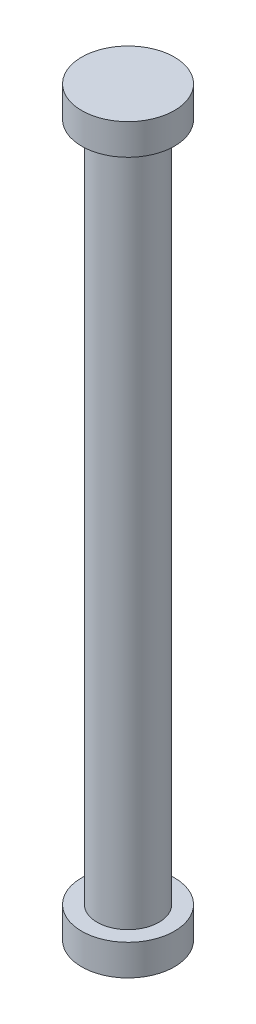
ISO-10303-21;
HEADER;
FILE_DESCRIPTION(('STEP AP214'),'2;1');
FILE_NAME('part.step','',(''),(''),'','','');
FILE_SCHEMA(('AUTOMOTIVE_DESIGN { 1 0 10303 214 1 1 1 1 }'));
ENDSEC;
DATA;
#1=APPLICATION_CONTEXT('core data for automotive mechanical design processes');
#2=APPLICATION_PROTOCOL_DEFINITION('international standard','automotive_design',2000,#1);
#3=PRODUCT_CONTEXT('',#1,'mechanical');
#4=PRODUCT('Part','Part','',(#3));
#5=PRODUCT_RELATED_PRODUCT_CATEGORY('part','',(#4));
#6=PRODUCT_DEFINITION_FORMATION('','',#4);
#7=PRODUCT_DEFINITION_CONTEXT('part definition',#1,'design');
#8=PRODUCT_DEFINITION('design','',#6,#7);
#9=PRODUCT_DEFINITION_SHAPE('','',#8);
#10=(LENGTH_UNIT() NAMED_UNIT(*) SI_UNIT(.MILLI.,.METRE.));
#11=(NAMED_UNIT(*) PLANE_ANGLE_UNIT() SI_UNIT($,.RADIAN.));
#12=(NAMED_UNIT(*) SI_UNIT($,.STERADIAN.) SOLID_ANGLE_UNIT());
#13=UNCERTAINTY_MEASURE_WITH_UNIT(LENGTH_MEASURE(1.E-05),#10,'distance_accuracy_value','');
#14=(GEOMETRIC_REPRESENTATION_CONTEXT(3) GLOBAL_UNCERTAINTY_ASSIGNED_CONTEXT((#13)) GLOBAL_UNIT_ASSIGNED_CONTEXT((#10,
#11,#12)) REPRESENTATION_CONTEXT('',''));
#15=CARTESIAN_POINT('',(0.,0.,0.));
#16=DIRECTION('',(0.,0.,1.));
#17=DIRECTION('',(1.,0.,0.));
#18=AXIS2_PLACEMENT_3D('',#15,#16,#17);
#19=CARTESIAN_POINT('',(0.,22.,0.));
#20=DIRECTION('',(0.,-1.,0.));
#21=DIRECTION('',(0.,0.,-1.));
#22=AXIS2_PLACEMENT_3D('',#19,#20,#21);
#23=CYLINDRICAL_SURFACE('',#22,1.);
#24=CARTESIAN_POINT('',(0.,22.,0.));
#25=DIRECTION('',(0.,1.,0.));
#26=DIRECTION('',(0.,0.,1.));
#27=AXIS2_PLACEMENT_3D('',#24,#25,#26);
#28=CIRCLE('',#27,1.);
#29=CARTESIAN_POINT('',(0.,22.,1.));
#30=VERTEX_POINT('',#29);
#31=EDGE_CURVE('E10',#30,#30,#28,.T.);
#32=ORIENTED_EDGE('',*,*,#31,.F.);
#33=EDGE_LOOP('',(#32));
#34=FACE_BOUND('',#33,.T.);
#35=CARTESIAN_POINT('',(0.,0.,0.));
#36=DIRECTION('',(0.,1.,0.));
#37=DIRECTION('',(0.,0.,1.));
#38=AXIS2_PLACEMENT_3D('',#35,#36,#37);
#39=CIRCLE('',#38,1.);
#40=CARTESIAN_POINT('',(0.,0.,1.));
#41=VERTEX_POINT('',#40);
#42=EDGE_CURVE('E36',#41,#41,#39,.T.);
#43=ORIENTED_EDGE('',*,*,#42,.T.);
#44=EDGE_LOOP('',(#43));
#45=FACE_BOUND('',#44,.T.);
#46=ADVANCED_FACE('F33',(#34,#45),#23,.T.);
#47=CARTESIAN_POINT('',(0.,-1.,0.));
#48=DIRECTION('',(0.,1.,0.));
#49=DIRECTION('',(0.,0.,1.));
#50=AXIS2_PLACEMENT_3D('',#47,#48,#49);
#51=CYLINDRICAL_SURFACE('',#50,1.5);
#52=CARTESIAN_POINT('',(0.,-1.,0.));
#53=DIRECTION('',(0.,-1.,0.));
#54=DIRECTION('',(0.,0.,-1.));
#55=AXIS2_PLACEMENT_3D('',#52,#53,#54);
#56=CIRCLE('',#55,1.5);
#57=CARTESIAN_POINT('',(0.,-1.,-1.5));
#58=VERTEX_POINT('',#57);
#59=EDGE_CURVE('E43',#58,#58,#56,.T.);
#60=ORIENTED_EDGE('',*,*,#59,.F.);
#61=EDGE_LOOP('',(#60));
#62=FACE_BOUND('',#61,.T.);
#63=CARTESIAN_POINT('',(0.,0.,0.));
#64=DIRECTION('',(0.,-1.,0.));
#65=DIRECTION('',(0.,0.,-1.));
#66=AXIS2_PLACEMENT_3D('',#63,#64,#65);
#67=CIRCLE('',#66,1.5);
#68=CARTESIAN_POINT('',(0.,0.,-1.5));
#69=VERTEX_POINT('',#68);
#70=EDGE_CURVE('E45',#69,#69,#67,.T.);
#71=ORIENTED_EDGE('',*,*,#70,.T.);
#72=EDGE_LOOP('',(#71));
#73=FACE_BOUND('',#72,.T.);
#74=ADVANCED_FACE('F72',(#62,#73),#51,.T.);
#75=CARTESIAN_POINT('',(0.,-1.,0.));
#76=DIRECTION('',(0.,-1.,0.));
#77=DIRECTION('',(0.,0.,-1.));
#78=AXIS2_PLACEMENT_3D('',#75,#76,#77);
#79=PLANE('',#78);
#80=ORIENTED_EDGE('',*,*,#59,.T.);
#81=EDGE_LOOP('',(#80));
#82=FACE_BOUND('',#81,.T.);
#83=ADVANCED_FACE('F77',(#82),#79,.T.);
#84=CARTESIAN_POINT('',(0.,0.,0.));
#85=DIRECTION('',(0.,-1.,0.));
#86=DIRECTION('',(0.,0.,-1.));
#87=AXIS2_PLACEMENT_3D('',#84,#85,#86);
#88=PLANE('',#87);
#89=ORIENTED_EDGE('',*,*,#42,.F.);
#90=EDGE_LOOP('',(#89));
#91=FACE_BOUND('',#90,.T.);
#92=ORIENTED_EDGE('',*,*,#70,.F.);
#93=EDGE_LOOP('',(#92));
#94=FACE_BOUND('',#93,.T.);
#95=ADVANCED_FACE('F69',(#91,#94),#88,.F.);
#96=CARTESIAN_POINT('',(0.,23.,0.));
#97=DIRECTION('',(0.,-1.,0.));
#98=DIRECTION('',(0.,0.,-1.));
#99=AXIS2_PLACEMENT_3D('',#96,#97,#98);
#100=CYLINDRICAL_SURFACE('',#99,1.5);
#101=CARTESIAN_POINT('',(0.,23.,0.));
#102=DIRECTION('',(0.,-1.,0.));
#103=DIRECTION('',(0.,0.,-1.));
#104=AXIS2_PLACEMENT_3D('',#101,#102,#103);
#105=CIRCLE('',#104,1.5);
#106=CARTESIAN_POINT('',(0.,23.,-1.5));
#107=VERTEX_POINT('',#106);
#108=EDGE_CURVE('E48',#107,#107,#105,.T.);
#109=ORIENTED_EDGE('',*,*,#108,.T.);
#110=EDGE_LOOP('',(#109));
#111=FACE_BOUND('',#110,.T.);
#112=CARTESIAN_POINT('',(0.,22.,0.));
#113=DIRECTION('',(0.,-1.,0.));
#114=DIRECTION('',(0.,0.,-1.));
#115=AXIS2_PLACEMENT_3D('',#112,#113,#114);
#116=CIRCLE('',#115,1.5);
#117=CARTESIAN_POINT('',(0.,22.,-1.5));
#118=VERTEX_POINT('',#117);
#119=EDGE_CURVE('E51',#118,#118,#116,.T.);
#120=ORIENTED_EDGE('',*,*,#119,.F.);
#121=EDGE_LOOP('',(#120));
#122=FACE_BOUND('',#121,.T.);
#123=ADVANCED_FACE('F57',(#111,#122),#100,.T.);
#124=CARTESIAN_POINT('',(0.,23.,0.));
#125=DIRECTION('',(0.,1.,0.));
#126=DIRECTION('',(0.,0.,-1.));
#127=AXIS2_PLACEMENT_3D('',#124,#125,#126);
#128=PLANE('',#127);
#129=ORIENTED_EDGE('',*,*,#108,.F.);
#130=EDGE_LOOP('',(#129));
#131=FACE_BOUND('',#130,.T.);
#132=ADVANCED_FACE('F60',(#131),#128,.T.);
#133=CARTESIAN_POINT('',(0.,22.,0.));
#134=DIRECTION('',(0.,1.,0.));
#135=DIRECTION('',(0.,0.,-1.));
#136=AXIS2_PLACEMENT_3D('',#133,#134,#135);
#137=PLANE('',#136);
#138=ORIENTED_EDGE('',*,*,#31,.T.);
#139=EDGE_LOOP('',(#138));
#140=FACE_BOUND('',#139,.T.);
#141=ORIENTED_EDGE('',*,*,#119,.T.);
#142=EDGE_LOOP('',(#141));
#143=FACE_BOUND('',#142,.T.);
#144=ADVANCED_FACE('F62',(#140,#143),#137,.F.);
#145=CLOSED_SHELL('',(#46,#74,#83,#95,#123,#132,#144));
#146=MANIFOLD_SOLID_BREP('B2',#145);
#147=ADVANCED_BREP_SHAPE_REPRESENTATION('',(#18,#146),#14);
#148=SHAPE_DEFINITION_REPRESENTATION(#9,#147);
ENDSEC;
END-ISO-10303-21;
